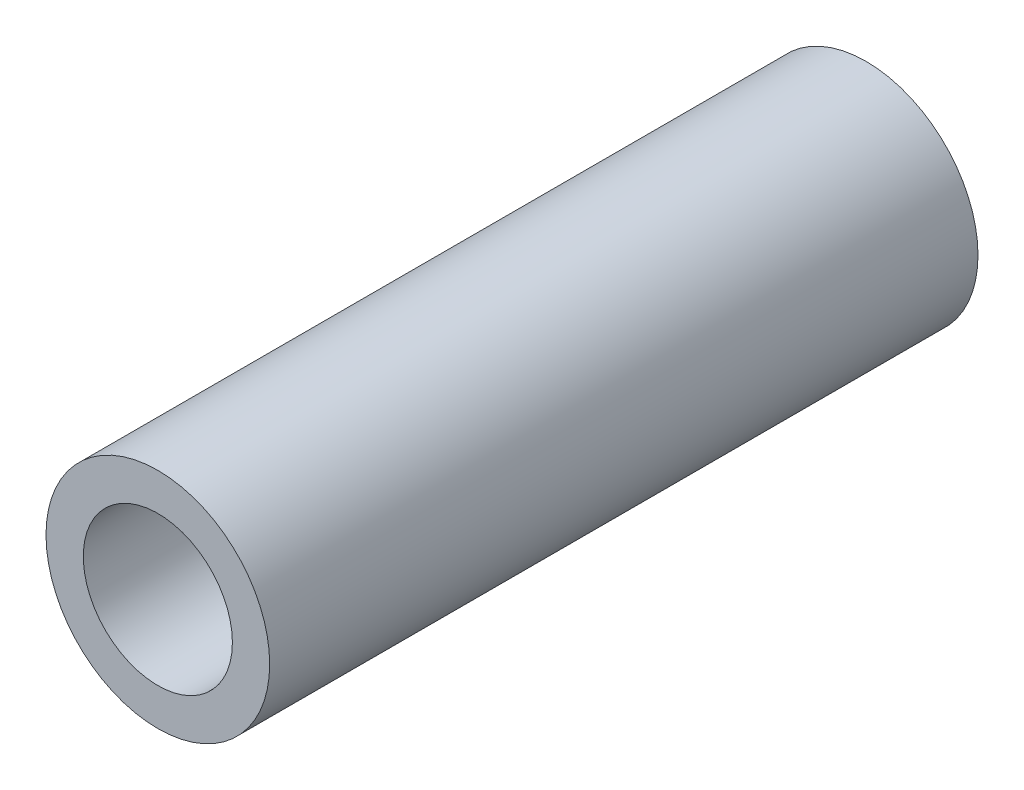
ISO-10303-21;
HEADER;
FILE_DESCRIPTION(('STEP AP214'),'2;1');
FILE_NAME('part.step','',(''),(''),'','','');
FILE_SCHEMA(('AUTOMOTIVE_DESIGN { 1 0 10303 214 1 1 1 1 }'));
ENDSEC;
DATA;
#1=APPLICATION_CONTEXT('core data for automotive mechanical design processes');
#2=APPLICATION_PROTOCOL_DEFINITION('international standard','automotive_design',2000,#1);
#3=PRODUCT_CONTEXT('',#1,'mechanical');
#4=PRODUCT('Part','Part','',(#3));
#5=PRODUCT_RELATED_PRODUCT_CATEGORY('part','',(#4));
#6=PRODUCT_DEFINITION_FORMATION('','',#4);
#7=PRODUCT_DEFINITION_CONTEXT('part definition',#1,'design');
#8=PRODUCT_DEFINITION('design','',#6,#7);
#9=PRODUCT_DEFINITION_SHAPE('','',#8);
#10=(LENGTH_UNIT() NAMED_UNIT(*) SI_UNIT(.MILLI.,.METRE.));
#11=(NAMED_UNIT(*) PLANE_ANGLE_UNIT() SI_UNIT($,.RADIAN.));
#12=(NAMED_UNIT(*) SI_UNIT($,.STERADIAN.) SOLID_ANGLE_UNIT());
#13=UNCERTAINTY_MEASURE_WITH_UNIT(LENGTH_MEASURE(1.E-05),#10,'distance_accuracy_value','');
#14=(GEOMETRIC_REPRESENTATION_CONTEXT(3) GLOBAL_UNCERTAINTY_ASSIGNED_CONTEXT((#13)) GLOBAL_UNIT_ASSIGNED_CONTEXT((#10,
#11,#12)) REPRESENTATION_CONTEXT('',''));
#15=CARTESIAN_POINT('',(0.,0.,0.));
#16=DIRECTION('',(0.,0.,1.));
#17=DIRECTION('',(1.,0.,0.));
#18=AXIS2_PLACEMENT_3D('',#15,#16,#17);
#19=CARTESIAN_POINT('',(0.,0.,19.));
#20=DIRECTION('',(0.,0.,1.));
#21=DIRECTION('',(1.,0.,0.));
#22=AXIS2_PLACEMENT_3D('',#19,#20,#21);
#23=PLANE('',#22);
#24=CARTESIAN_POINT('',(0.,0.,19.));
#25=DIRECTION('',(0.,0.,1.));
#26=DIRECTION('',(1.,0.,0.));
#27=AXIS2_PLACEMENT_3D('',#24,#25,#26);
#28=CIRCLE('',#27,3.);
#29=CARTESIAN_POINT('',(3.,0.,19.));
#30=VERTEX_POINT('',#29);
#31=EDGE_CURVE('E10',#30,#30,#28,.T.);
#32=ORIENTED_EDGE('',*,*,#31,.T.);
#33=EDGE_LOOP('',(#32));
#34=FACE_BOUND('',#33,.T.);
#35=CARTESIAN_POINT('',(0.,0.,19.));
#36=DIRECTION('',(0.,0.,1.));
#37=DIRECTION('',(1.,0.,0.));
#38=AXIS2_PLACEMENT_3D('',#35,#36,#37);
#39=CIRCLE('',#38,2.);
#40=CARTESIAN_POINT('',(2.,0.,19.));
#41=VERTEX_POINT('',#40);
#42=EDGE_CURVE('E43',#41,#41,#39,.T.);
#43=ORIENTED_EDGE('',*,*,#42,.F.);
#44=EDGE_LOOP('',(#43));
#45=FACE_BOUND('',#44,.T.);
#46=ADVANCED_FACE('F32',(#34,#45),#23,.T.);
#47=CARTESIAN_POINT('',(0.,0.,0.));
#48=DIRECTION('',(0.,0.,1.));
#49=DIRECTION('',(1.,0.,0.));
#50=AXIS2_PLACEMENT_3D('',#47,#48,#49);
#51=PLANE('',#50);
#52=CARTESIAN_POINT('',(0.,0.,0.));
#53=DIRECTION('',(0.,0.,1.));
#54=DIRECTION('',(1.,0.,0.));
#55=AXIS2_PLACEMENT_3D('',#52,#53,#54);
#56=CIRCLE('',#55,3.);
#57=CARTESIAN_POINT('',(3.,0.,0.));
#58=VERTEX_POINT('',#57);
#59=EDGE_CURVE('E36',#58,#58,#56,.T.);
#60=ORIENTED_EDGE('',*,*,#59,.F.);
#61=EDGE_LOOP('',(#60));
#62=FACE_BOUND('',#61,.T.);
#63=CARTESIAN_POINT('',(0.,0.,0.));
#64=DIRECTION('',(0.,0.,1.));
#65=DIRECTION('',(1.,0.,0.));
#66=AXIS2_PLACEMENT_3D('',#63,#64,#65);
#67=CIRCLE('',#66,2.);
#68=CARTESIAN_POINT('',(2.,0.,0.));
#69=VERTEX_POINT('',#68);
#70=EDGE_CURVE('E45',#69,#69,#67,.T.);
#71=ORIENTED_EDGE('',*,*,#70,.T.);
#72=EDGE_LOOP('',(#71));
#73=FACE_BOUND('',#72,.T.);
#74=ADVANCED_FACE('F55',(#62,#73),#51,.F.);
#75=CARTESIAN_POINT('',(0.,0.,19.));
#76=DIRECTION('',(0.,0.,-1.));
#77=DIRECTION('',(-1.,0.,0.));
#78=AXIS2_PLACEMENT_3D('',#75,#76,#77);
#79=CYLINDRICAL_SURFACE('',#78,3.);
#80=ORIENTED_EDGE('',*,*,#31,.F.);
#81=EDGE_LOOP('',(#80));
#82=FACE_BOUND('',#81,.T.);
#83=ORIENTED_EDGE('',*,*,#59,.T.);
#84=EDGE_LOOP('',(#83));
#85=FACE_BOUND('',#84,.T.);
#86=ADVANCED_FACE('F34',(#82,#85),#79,.T.);
#87=CARTESIAN_POINT('',(0.,0.,19.));
#88=DIRECTION('',(0.,0.,-1.));
#89=DIRECTION('',(-1.,0.,0.));
#90=AXIS2_PLACEMENT_3D('',#87,#88,#89);
#91=CYLINDRICAL_SURFACE('',#90,2.);
#92=ORIENTED_EDGE('',*,*,#42,.T.);
#93=EDGE_LOOP('',(#92));
#94=FACE_BOUND('',#93,.T.);
#95=ORIENTED_EDGE('',*,*,#70,.F.);
#96=EDGE_LOOP('',(#95));
#97=FACE_BOUND('',#96,.T.);
#98=ADVANCED_FACE('F51',(#94,#97),#91,.F.);
#99=CLOSED_SHELL('',(#46,#74,#86,#98));
#100=MANIFOLD_SOLID_BREP('B2',#99);
#101=ADVANCED_BREP_SHAPE_REPRESENTATION('',(#18,#100),#14);
#102=SHAPE_DEFINITION_REPRESENTATION(#9,#101);
ENDSEC;
END-ISO-10303-21;
